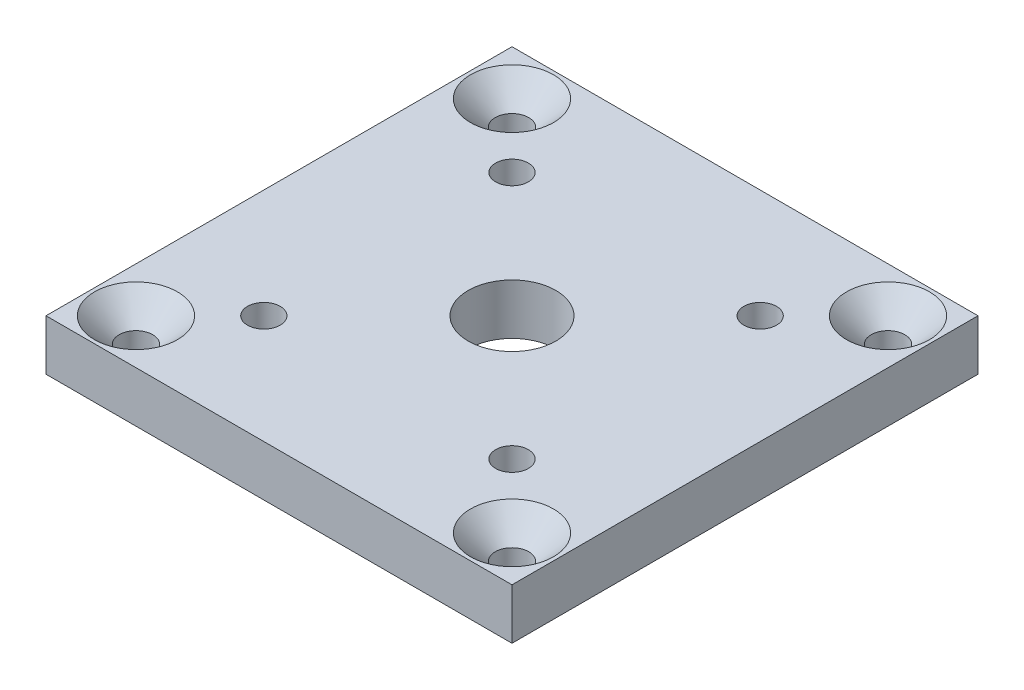
ISO-10303-21;
HEADER;
FILE_DESCRIPTION(('STEP AP214'),'2;1');
FILE_NAME('part.step','',(''),(''),'','','');
FILE_SCHEMA(('AUTOMOTIVE_DESIGN { 1 0 10303 214 1 1 1 1 }'));
ENDSEC;
DATA;
#1=APPLICATION_CONTEXT('core data for automotive mechanical design processes');
#2=APPLICATION_PROTOCOL_DEFINITION('international standard','automotive_design',2000,#1);
#3=PRODUCT_CONTEXT('',#1,'mechanical');
#4=PRODUCT('Part','Part','',(#3));
#5=PRODUCT_RELATED_PRODUCT_CATEGORY('part','',(#4));
#6=PRODUCT_DEFINITION_FORMATION('','',#4);
#7=PRODUCT_DEFINITION_CONTEXT('part definition',#1,'design');
#8=PRODUCT_DEFINITION('design','',#6,#7);
#9=PRODUCT_DEFINITION_SHAPE('','',#8);
#10=(LENGTH_UNIT() NAMED_UNIT(*) SI_UNIT(.MILLI.,.METRE.));
#11=(NAMED_UNIT(*) PLANE_ANGLE_UNIT() SI_UNIT($,.RADIAN.));
#12=(NAMED_UNIT(*) SI_UNIT($,.STERADIAN.) SOLID_ANGLE_UNIT());
#13=UNCERTAINTY_MEASURE_WITH_UNIT(LENGTH_MEASURE(1.E-05),#10,'distance_accuracy_value','');
#14=(GEOMETRIC_REPRESENTATION_CONTEXT(3) GLOBAL_UNCERTAINTY_ASSIGNED_CONTEXT((#13)) GLOBAL_UNIT_ASSIGNED_CONTEXT((#10,
#11,#12)) REPRESENTATION_CONTEXT('',''));
#15=CARTESIAN_POINT('',(0.,0.,0.));
#16=DIRECTION('',(0.,0.,1.));
#17=DIRECTION('',(1.,0.,0.));
#18=AXIS2_PLACEMENT_3D('',#15,#16,#17);
#19=CARTESIAN_POINT('',(0.,6.35,0.));
#20=DIRECTION('',(0.,-1.,0.));
#21=DIRECTION('',(0.,0.,-1.));
#22=AXIS2_PLACEMENT_3D('',#19,#20,#21);
#23=PLANE('',#22);
#24=CARTESIAN_POINT('',(52.78,6.35,-52.78));
#25=DIRECTION('',(0.,-1.,0.));
#26=DIRECTION('',(0.,0.,-1.));
#27=AXIS2_PLACEMENT_3D('',#24,#25,#26);
#28=CIRCLE('',#27,5.20000000000001);
#29=CARTESIAN_POINT('',(52.78,6.35,-57.98));
#30=VERTEX_POINT('',#29);
#31=EDGE_CURVE('E146',#30,#30,#28,.T.);
#32=ORIENTED_EDGE('',*,*,#31,.T.);
#33=EDGE_LOOP('',(#32));
#34=FACE_BOUND('',#33,.T.);
#35=CARTESIAN_POINT('',(52.78,6.35,-5.63999999999999));
#36=DIRECTION('',(0.,-1.,0.));
#37=DIRECTION('',(0.,0.,-1.));
#38=AXIS2_PLACEMENT_3D('',#35,#36,#37);
#39=CIRCLE('',#38,5.20000000000001);
#40=CARTESIAN_POINT('',(52.78,6.35,-10.84));
#41=VERTEX_POINT('',#40);
#42=EDGE_CURVE('E143',#41,#41,#39,.T.);
#43=ORIENTED_EDGE('',*,*,#42,.T.);
#44=EDGE_LOOP('',(#43));
#45=FACE_BOUND('',#44,.T.);
#46=CARTESIAN_POINT('',(5.63999999999999,6.35,-52.78));
#47=DIRECTION('',(0.,-1.,0.));
#48=DIRECTION('',(0.,0.,-1.));
#49=AXIS2_PLACEMENT_3D('',#46,#47,#48);
#50=CIRCLE('',#49,5.20000000000001);
#51=CARTESIAN_POINT('',(5.63999999999999,6.35,-57.98));
#52=VERTEX_POINT('',#51);
#53=EDGE_CURVE('E140',#52,#52,#50,.T.);
#54=ORIENTED_EDGE('',*,*,#53,.T.);
#55=EDGE_LOOP('',(#54));
#56=FACE_BOUND('',#55,.T.);
#57=CARTESIAN_POINT('',(5.63999999999999,6.35,-5.63999999999999));
#58=DIRECTION('',(0.,-1.,0.));
#59=DIRECTION('',(0.,0.,-1.));
#60=AXIS2_PLACEMENT_3D('',#57,#58,#59);
#61=CIRCLE('',#60,5.20000000000001);
#62=CARTESIAN_POINT('',(5.63999999999999,6.35,-0.439999999999983));
#63=VERTEX_POINT('',#62);
#64=EDGE_CURVE('E137',#63,#63,#61,.T.);
#65=ORIENTED_EDGE('',*,*,#64,.T.);
#66=EDGE_LOOP('',(#65));
#67=FACE_BOUND('',#66,.T.);
#68=DIRECTION('',(0.,0.,1.));
#69=VECTOR('',#68,1.);
#70=CARTESIAN_POINT('',(0.,6.35,0.));
#71=LINE('',#70,#69);
#72=CARTESIAN_POINT('',(0.,6.35,-58.42));
#73=VERTEX_POINT('',#72);
#74=CARTESIAN_POINT('',(0.,6.35,0.));
#75=VERTEX_POINT('',#74);
#76=EDGE_CURVE('E85',#73,#75,#71,.T.);
#77=ORIENTED_EDGE('',*,*,#76,.T.);
#78=DIRECTION('',(1.,0.,0.));
#79=VECTOR('',#78,1.);
#80=CARTESIAN_POINT('',(0.,6.35,0.));
#81=LINE('',#80,#79);
#82=CARTESIAN_POINT('',(58.42,6.35,0.));
#83=VERTEX_POINT('',#82);
#84=EDGE_CURVE('E80',#75,#83,#81,.T.);
#85=ORIENTED_EDGE('',*,*,#84,.T.);
#86=DIRECTION('',(0.,0.,-1.));
#87=VECTOR('',#86,1.);
#88=CARTESIAN_POINT('',(58.42,6.35,0.));
#89=LINE('',#88,#87);
#90=CARTESIAN_POINT('',(58.42,6.35,-58.42));
#91=VERTEX_POINT('',#90);
#92=EDGE_CURVE('E83',#83,#91,#89,.T.);
#93=ORIENTED_EDGE('',*,*,#92,.T.);
#94=DIRECTION('',(-1.,0.,0.));
#95=VECTOR('',#94,1.);
#96=CARTESIAN_POINT('',(0.,6.35,-58.42));
#97=LINE('',#96,#95);
#98=EDGE_CURVE('E49',#91,#73,#97,.T.);
#99=ORIENTED_EDGE('',*,*,#98,.T.);
#100=EDGE_LOOP('',(#77,#85,#93,#99));
#101=FACE_BOUND('',#100,.T.);
#102=CARTESIAN_POINT('',(13.6536508138959,6.35,-44.766349186104));
#103=DIRECTION('',(0.,1.,0.));
#104=DIRECTION('',(0.,0.,1.));
#105=AXIS2_PLACEMENT_3D('',#102,#103,#104);
#106=CIRCLE('',#105,2.05);
#107=CARTESIAN_POINT('',(13.6536508138959,6.35,-42.716349186104));
#108=VERTEX_POINT('',#107);
#109=EDGE_CURVE('E237',#108,#108,#106,.T.);
#110=ORIENTED_EDGE('',*,*,#109,.F.);
#111=EDGE_LOOP('',(#110));
#112=FACE_BOUND('',#111,.T.);
#113=CARTESIAN_POINT('',(44.766349186104,6.35,-44.766349186104));
#114=DIRECTION('',(0.,1.,0.));
#115=DIRECTION('',(0.,0.,1.));
#116=AXIS2_PLACEMENT_3D('',#113,#114,#115);
#117=CIRCLE('',#116,2.05);
#118=CARTESIAN_POINT('',(44.766349186104,6.35,-42.716349186104));
#119=VERTEX_POINT('',#118);
#120=EDGE_CURVE('E240',#119,#119,#117,.T.);
#121=ORIENTED_EDGE('',*,*,#120,.F.);
#122=EDGE_LOOP('',(#121));
#123=FACE_BOUND('',#122,.T.);
#124=CARTESIAN_POINT('',(44.766349186104,6.35,-13.6536508138959));
#125=DIRECTION('',(0.,1.,0.));
#126=DIRECTION('',(0.,0.,1.));
#127=AXIS2_PLACEMENT_3D('',#124,#125,#126);
#128=CIRCLE('',#127,2.04999999999999);
#129=CARTESIAN_POINT('',(44.766349186104,6.35,-11.603650813896));
#130=VERTEX_POINT('',#129);
#131=EDGE_CURVE('E243',#130,#130,#128,.T.);
#132=ORIENTED_EDGE('',*,*,#131,.F.);
#133=EDGE_LOOP('',(#132));
#134=FACE_BOUND('',#133,.T.);
#135=CARTESIAN_POINT('',(13.6536508138959,6.35,-13.6536508138959));
#136=DIRECTION('',(0.,1.,0.));
#137=DIRECTION('',(0.,0.,1.));
#138=AXIS2_PLACEMENT_3D('',#135,#136,#137);
#139=CIRCLE('',#138,2.05);
#140=CARTESIAN_POINT('',(13.6536508138959,6.35,-11.6036508138959));
#141=VERTEX_POINT('',#140);
#142=EDGE_CURVE('E246',#141,#141,#139,.T.);
#143=ORIENTED_EDGE('',*,*,#142,.F.);
#144=EDGE_LOOP('',(#143));
#145=FACE_BOUND('',#144,.T.);
#146=CARTESIAN_POINT('',(29.21,6.35,-29.21));
#147=DIRECTION('',(0.,1.,0.));
#148=DIRECTION('',(0.,0.,1.));
#149=AXIS2_PLACEMENT_3D('',#146,#147,#148);
#150=CIRCLE('',#149,5.5);
#151=CARTESIAN_POINT('',(29.21,6.35,-23.71));
#152=VERTEX_POINT('',#151);
#153=EDGE_CURVE('E249',#152,#152,#150,.T.);
#154=ORIENTED_EDGE('',*,*,#153,.F.);
#155=EDGE_LOOP('',(#154));
#156=FACE_BOUND('',#155,.T.);
#157=ADVANCED_FACE('F32',(#34,#45,#56,#67,#101,#112,#123,#134,#145,#156),#23,.F.);
#158=CARTESIAN_POINT('',(0.,0.,0.));
#159=DIRECTION('',(0.,-1.,0.));
#160=DIRECTION('',(0.,0.,-1.));
#161=AXIS2_PLACEMENT_3D('',#158,#159,#160);
#162=PLANE('',#161);
#163=CARTESIAN_POINT('',(13.6536508138959,0.,-44.766349186104));
#164=DIRECTION('',(0.,-1.,0.));
#165=DIRECTION('',(0.,0.,-1.));
#166=AXIS2_PLACEMENT_3D('',#163,#164,#165);
#167=CIRCLE('',#166,4.53000000000001);
#168=CARTESIAN_POINT('',(13.6536508138959,0.,-49.296349186104));
#169=VERTEX_POINT('',#168);
#170=EDGE_CURVE('E119',#169,#169,#167,.F.);
#171=ORIENTED_EDGE('',*,*,#170,.T.);
#172=EDGE_LOOP('',(#171));
#173=FACE_BOUND('',#172,.T.);
#174=CARTESIAN_POINT('',(44.766349186104,0.,-44.766349186104));
#175=DIRECTION('',(0.,-1.,0.));
#176=DIRECTION('',(0.,0.,-1.));
#177=AXIS2_PLACEMENT_3D('',#174,#175,#176);
#178=CIRCLE('',#177,4.53000000000001);
#179=CARTESIAN_POINT('',(44.766349186104,0.,-49.296349186104));
#180=VERTEX_POINT('',#179);
#181=EDGE_CURVE('E116',#180,#180,#178,.F.);
#182=ORIENTED_EDGE('',*,*,#181,.T.);
#183=EDGE_LOOP('',(#182));
#184=FACE_BOUND('',#183,.T.);
#185=CARTESIAN_POINT('',(44.766349186104,0.,-13.6536508138959));
#186=DIRECTION('',(0.,-1.,0.));
#187=DIRECTION('',(0.,0.,-1.));
#188=AXIS2_PLACEMENT_3D('',#185,#186,#187);
#189=CIRCLE('',#188,4.52999999999999);
#190=CARTESIAN_POINT('',(44.766349186104,0.,-18.1836508138959));
#191=VERTEX_POINT('',#190);
#192=EDGE_CURVE('E113',#191,#191,#189,.F.);
#193=ORIENTED_EDGE('',*,*,#192,.T.);
#194=EDGE_LOOP('',(#193));
#195=FACE_BOUND('',#194,.T.);
#196=CARTESIAN_POINT('',(13.6536508138959,0.,-13.6536508138959));
#197=DIRECTION('',(0.,-1.,0.));
#198=DIRECTION('',(0.,0.,-1.));
#199=AXIS2_PLACEMENT_3D('',#196,#197,#198);
#200=CIRCLE('',#199,4.53000000000001);
#201=CARTESIAN_POINT('',(13.6536508138959,0.,-18.183650813896));
#202=VERTEX_POINT('',#201);
#203=EDGE_CURVE('E110',#202,#202,#200,.F.);
#204=ORIENTED_EDGE('',*,*,#203,.T.);
#205=EDGE_LOOP('',(#204));
#206=FACE_BOUND('',#205,.T.);
#207=CARTESIAN_POINT('',(5.63999999999999,0.,-5.63999999999999));
#208=DIRECTION('',(0.,1.,0.));
#209=DIRECTION('',(0.,0.,1.));
#210=AXIS2_PLACEMENT_3D('',#207,#208,#209);
#211=CIRCLE('',#210,2.1);
#212=CARTESIAN_POINT('',(5.63999999999999,0.,-3.53999999999999));
#213=VERTEX_POINT('',#212);
#214=EDGE_CURVE('E232',#213,#213,#211,.T.);
#215=ORIENTED_EDGE('',*,*,#214,.T.);
#216=EDGE_LOOP('',(#215));
#217=FACE_BOUND('',#216,.T.);
#218=CARTESIAN_POINT('',(52.78,0.,-52.78));
#219=DIRECTION('',(0.,1.,0.));
#220=DIRECTION('',(0.,0.,1.));
#221=AXIS2_PLACEMENT_3D('',#218,#219,#220);
#222=CIRCLE('',#221,2.1);
#223=CARTESIAN_POINT('',(52.78,0.,-50.68));
#224=VERTEX_POINT('',#223);
#225=EDGE_CURVE('E225',#224,#224,#222,.T.);
#226=ORIENTED_EDGE('',*,*,#225,.T.);
#227=EDGE_LOOP('',(#226));
#228=FACE_BOUND('',#227,.T.);
#229=DIRECTION('',(0.,0.,1.));
#230=VECTOR('',#229,1.);
#231=CARTESIAN_POINT('',(0.,0.,0.));
#232=LINE('',#231,#230);
#233=CARTESIAN_POINT('',(0.,0.,-58.42));
#234=VERTEX_POINT('',#233);
#235=CARTESIAN_POINT('',(0.,0.,0.));
#236=VERTEX_POINT('',#235);
#237=EDGE_CURVE('E100',#234,#236,#232,.T.);
#238=ORIENTED_EDGE('',*,*,#237,.F.);
#239=DIRECTION('',(-1.,0.,0.));
#240=VECTOR('',#239,1.);
#241=CARTESIAN_POINT('',(0.,0.,-58.42));
#242=LINE('',#241,#240);
#243=CARTESIAN_POINT('',(58.42,0.,-58.42));
#244=VERTEX_POINT('',#243);
#245=EDGE_CURVE('E72',#244,#234,#242,.T.);
#246=ORIENTED_EDGE('',*,*,#245,.F.);
#247=DIRECTION('',(0.,0.,-1.));
#248=VECTOR('',#247,1.);
#249=CARTESIAN_POINT('',(58.42,0.,0.));
#250=LINE('',#249,#248);
#251=CARTESIAN_POINT('',(58.42,0.,0.));
#252=VERTEX_POINT('',#251);
#253=EDGE_CURVE('E66',#252,#244,#250,.T.);
#254=ORIENTED_EDGE('',*,*,#253,.F.);
#255=DIRECTION('',(1.,0.,0.));
#256=VECTOR('',#255,1.);
#257=CARTESIAN_POINT('',(0.,0.,0.));
#258=LINE('',#257,#256);
#259=EDGE_CURVE('E90',#236,#252,#258,.T.);
#260=ORIENTED_EDGE('',*,*,#259,.F.);
#261=EDGE_LOOP('',(#238,#246,#254,#260));
#262=FACE_BOUND('',#261,.T.);
#263=CARTESIAN_POINT('',(5.63999999999999,0.,-52.78));
#264=DIRECTION('',(0.,1.,0.));
#265=DIRECTION('',(0.,0.,1.));
#266=AXIS2_PLACEMENT_3D('',#263,#264,#265);
#267=CIRCLE('',#266,2.1);
#268=CARTESIAN_POINT('',(5.63999999999999,0.,-50.68));
#269=VERTEX_POINT('',#268);
#270=EDGE_CURVE('E103',#269,#269,#267,.T.);
#271=ORIENTED_EDGE('',*,*,#270,.T.);
#272=EDGE_LOOP('',(#271));
#273=FACE_BOUND('',#272,.T.);
#274=CARTESIAN_POINT('',(52.78,0.,-5.63999999999999));
#275=DIRECTION('',(0.,1.,0.));
#276=DIRECTION('',(0.,0.,1.));
#277=AXIS2_PLACEMENT_3D('',#274,#275,#276);
#278=CIRCLE('',#277,2.1);
#279=CARTESIAN_POINT('',(52.78,0.,-3.54));
#280=VERTEX_POINT('',#279);
#281=EDGE_CURVE('E227',#280,#280,#278,.T.);
#282=ORIENTED_EDGE('',*,*,#281,.T.);
#283=EDGE_LOOP('',(#282));
#284=FACE_BOUND('',#283,.T.);
#285=CARTESIAN_POINT('',(29.21,0.,-29.21));
#286=DIRECTION('',(0.,1.,0.));
#287=DIRECTION('',(0.,0.,1.));
#288=AXIS2_PLACEMENT_3D('',#285,#286,#287);
#289=CIRCLE('',#288,5.5);
#290=CARTESIAN_POINT('',(29.21,0.,-23.71));
#291=VERTEX_POINT('',#290);
#292=EDGE_CURVE('E250',#291,#291,#289,.T.);
#293=ORIENTED_EDGE('',*,*,#292,.T.);
#294=EDGE_LOOP('',(#293));
#295=FACE_BOUND('',#294,.T.);
#296=ADVANCED_FACE('F171',(#173,#184,#195,#206,#217,#228,#262,#273,#284,#295),#162,.T.);
#297=CARTESIAN_POINT('',(0.,6.35,0.));
#298=DIRECTION('',(1.,0.,0.));
#299=DIRECTION('',(0.,0.,-1.));
#300=AXIS2_PLACEMENT_3D('',#297,#298,#299);
#301=PLANE('',#300);
#302=ORIENTED_EDGE('',*,*,#237,.T.);
#303=DIRECTION('',(0.,-1.,0.));
#304=VECTOR('',#303,1.);
#305=CARTESIAN_POINT('',(0.,6.35,0.));
#306=LINE('',#305,#304);
#307=EDGE_CURVE('E91',#75,#236,#306,.T.);
#308=ORIENTED_EDGE('',*,*,#307,.F.);
#309=ORIENTED_EDGE('',*,*,#76,.F.);
#310=DIRECTION('',(0.,-1.,0.));
#311=VECTOR('',#310,1.);
#312=CARTESIAN_POINT('',(0.,6.35,-58.42));
#313=LINE('',#312,#311);
#314=EDGE_CURVE('E96',#73,#234,#313,.T.);
#315=ORIENTED_EDGE('',*,*,#314,.T.);
#316=EDGE_LOOP('',(#302,#308,#309,#315));
#317=FACE_BOUND('',#316,.T.);
#318=ADVANCED_FACE('F177',(#317),#301,.F.);
#319=CARTESIAN_POINT('',(0.,6.35,0.));
#320=DIRECTION('',(0.,0.,-1.));
#321=DIRECTION('',(-1.,0.,0.));
#322=AXIS2_PLACEMENT_3D('',#319,#320,#321);
#323=PLANE('',#322);
#324=ORIENTED_EDGE('',*,*,#259,.T.);
#325=DIRECTION('',(0.,-1.,0.));
#326=VECTOR('',#325,1.);
#327=CARTESIAN_POINT('',(58.42,6.35,0.));
#328=LINE('',#327,#326);
#329=EDGE_CURVE('E88',#83,#252,#328,.T.);
#330=ORIENTED_EDGE('',*,*,#329,.F.);
#331=ORIENTED_EDGE('',*,*,#84,.F.);
#332=ORIENTED_EDGE('',*,*,#307,.T.);
#333=EDGE_LOOP('',(#324,#330,#331,#332));
#334=FACE_BOUND('',#333,.T.);
#335=ADVANCED_FACE('F89',(#334),#323,.F.);
#336=CARTESIAN_POINT('',(58.42,6.35,0.));
#337=DIRECTION('',(-1.,0.,0.));
#338=DIRECTION('',(0.,0.,1.));
#339=AXIS2_PLACEMENT_3D('',#336,#337,#338);
#340=PLANE('',#339);
#341=ORIENTED_EDGE('',*,*,#253,.T.);
#342=DIRECTION('',(0.,-1.,0.));
#343=VECTOR('',#342,1.);
#344=CARTESIAN_POINT('',(58.42,6.35,-58.42));
#345=LINE('',#344,#343);
#346=EDGE_CURVE('E92',#91,#244,#345,.T.);
#347=ORIENTED_EDGE('',*,*,#346,.F.);
#348=ORIENTED_EDGE('',*,*,#92,.F.);
#349=ORIENTED_EDGE('',*,*,#329,.T.);
#350=EDGE_LOOP('',(#341,#347,#348,#349));
#351=FACE_BOUND('',#350,.T.);
#352=ADVANCED_FACE('F94',(#351),#340,.F.);
#353=CARTESIAN_POINT('',(0.,6.35,-58.42));
#354=DIRECTION('',(0.,0.,1.));
#355=DIRECTION('',(1.,0.,0.));
#356=AXIS2_PLACEMENT_3D('',#353,#354,#355);
#357=PLANE('',#356);
#358=ORIENTED_EDGE('',*,*,#245,.T.);
#359=ORIENTED_EDGE('',*,*,#314,.F.);
#360=ORIENTED_EDGE('',*,*,#98,.F.);
#361=ORIENTED_EDGE('',*,*,#346,.T.);
#362=EDGE_LOOP('',(#358,#359,#360,#361));
#363=FACE_BOUND('',#362,.T.);
#364=ADVANCED_FACE('F184',(#363),#357,.F.);
#365=CARTESIAN_POINT('',(5.63999999999999,6.35,-52.78));
#366=DIRECTION('',(0.,-1.,0.));
#367=DIRECTION('',(0.,0.,-1.));
#368=AXIS2_PLACEMENT_3D('',#365,#366,#367);
#369=CYLINDRICAL_SURFACE('',#368,2.1);
#370=CARTESIAN_POINT('',(5.63999999999999,3.25000000000001,-52.78));
#371=DIRECTION('',(0.,-1.,0.));
#372=DIRECTION('',(0.,0.,-1.));
#373=AXIS2_PLACEMENT_3D('',#370,#371,#372);
#374=CIRCLE('',#373,2.1);
#375=CARTESIAN_POINT('',(5.63999999999999,3.25000000000001,-54.88));
#376=VERTEX_POINT('',#375);
#377=EDGE_CURVE('E41',#376,#376,#374,.F.);
#378=ORIENTED_EDGE('',*,*,#377,.T.);
#379=EDGE_LOOP('',(#378));
#380=FACE_BOUND('',#379,.T.);
#381=ORIENTED_EDGE('',*,*,#270,.F.);
#382=EDGE_LOOP('',(#381));
#383=FACE_BOUND('',#382,.T.);
#384=ADVANCED_FACE('F154',(#380,#383),#369,.F.);
#385=CARTESIAN_POINT('',(52.78,6.35,-52.78));
#386=DIRECTION('',(0.,-1.,0.));
#387=DIRECTION('',(0.,0.,-1.));
#388=AXIS2_PLACEMENT_3D('',#385,#386,#387);
#389=CYLINDRICAL_SURFACE('',#388,2.1);
#390=CARTESIAN_POINT('',(52.78,3.25000000000001,-52.78));
#391=DIRECTION('',(0.,-1.,0.));
#392=DIRECTION('',(0.,0.,-1.));
#393=AXIS2_PLACEMENT_3D('',#390,#391,#392);
#394=CIRCLE('',#393,2.1);
#395=CARTESIAN_POINT('',(52.78,3.25000000000001,-54.88));
#396=VERTEX_POINT('',#395);
#397=EDGE_CURVE('E134',#396,#396,#394,.F.);
#398=ORIENTED_EDGE('',*,*,#397,.T.);
#399=EDGE_LOOP('',(#398));
#400=FACE_BOUND('',#399,.T.);
#401=ORIENTED_EDGE('',*,*,#225,.F.);
#402=EDGE_LOOP('',(#401));
#403=FACE_BOUND('',#402,.T.);
#404=ADVANCED_FACE('F219',(#400,#403),#389,.F.);
#405=CARTESIAN_POINT('',(52.78,6.35,-5.63999999999999));
#406=DIRECTION('',(0.,-1.,0.));
#407=DIRECTION('',(0.,0.,-1.));
#408=AXIS2_PLACEMENT_3D('',#405,#406,#407);
#409=CYLINDRICAL_SURFACE('',#408,2.1);
#410=CARTESIAN_POINT('',(52.78,3.25000000000001,-5.63999999999999));
#411=DIRECTION('',(0.,-1.,0.));
#412=DIRECTION('',(0.,0.,-1.));
#413=AXIS2_PLACEMENT_3D('',#410,#411,#412);
#414=CIRCLE('',#413,2.1);
#415=CARTESIAN_POINT('',(52.78,3.25000000000001,-7.73999999999999));
#416=VERTEX_POINT('',#415);
#417=EDGE_CURVE('E149',#416,#416,#414,.F.);
#418=ORIENTED_EDGE('',*,*,#417,.T.);
#419=EDGE_LOOP('',(#418));
#420=FACE_BOUND('',#419,.T.);
#421=ORIENTED_EDGE('',*,*,#281,.F.);
#422=EDGE_LOOP('',(#421));
#423=FACE_BOUND('',#422,.T.);
#424=ADVANCED_FACE('F222',(#420,#423),#409,.F.);
#425=CARTESIAN_POINT('',(5.63999999999999,6.35,-5.63999999999999));
#426=DIRECTION('',(0.,-1.,0.));
#427=DIRECTION('',(0.,0.,-1.));
#428=AXIS2_PLACEMENT_3D('',#425,#426,#427);
#429=CYLINDRICAL_SURFACE('',#428,2.1);
#430=CARTESIAN_POINT('',(5.63999999999999,3.25000000000001,-5.63999999999999));
#431=DIRECTION('',(0.,-1.,0.));
#432=DIRECTION('',(0.,0.,-1.));
#433=AXIS2_PLACEMENT_3D('',#430,#431,#432);
#434=CIRCLE('',#433,2.1);
#435=CARTESIAN_POINT('',(5.63999999999999,3.25000000000001,-3.53999999999999));
#436=VERTEX_POINT('',#435);
#437=EDGE_CURVE('E11',#436,#436,#434,.F.);
#438=ORIENTED_EDGE('',*,*,#437,.T.);
#439=EDGE_LOOP('',(#438));
#440=FACE_BOUND('',#439,.T.);
#441=ORIENTED_EDGE('',*,*,#214,.F.);
#442=EDGE_LOOP('',(#441));
#443=FACE_BOUND('',#442,.T.);
#444=ADVANCED_FACE('F280',(#440,#443),#429,.F.);
#445=CARTESIAN_POINT('',(13.6536508138959,6.35,-44.766349186104));
#446=DIRECTION('',(0.,-1.,0.));
#447=DIRECTION('',(0.,0.,-1.));
#448=AXIS2_PLACEMENT_3D('',#445,#446,#447);
#449=CYLINDRICAL_SURFACE('',#448,2.05);
#450=CARTESIAN_POINT('',(13.6536508138959,2.48000000000001,-44.766349186104));
#451=DIRECTION('',(0.,-1.,0.));
#452=DIRECTION('',(0.,0.,-1.));
#453=AXIS2_PLACEMENT_3D('',#450,#451,#452);
#454=CIRCLE('',#453,2.05);
#455=CARTESIAN_POINT('',(13.6536508138959,2.48000000000001,-46.816349186104));
#456=VERTEX_POINT('',#455);
#457=EDGE_CURVE('E122',#456,#456,#454,.T.);
#458=ORIENTED_EDGE('',*,*,#457,.T.);
#459=EDGE_LOOP('',(#458));
#460=FACE_BOUND('',#459,.T.);
#461=ORIENTED_EDGE('',*,*,#109,.T.);
#462=EDGE_LOOP('',(#461));
#463=FACE_BOUND('',#462,.T.);
#464=ADVANCED_FACE('F276',(#460,#463),#449,.F.);
#465=CARTESIAN_POINT('',(44.766349186104,6.35,-44.766349186104));
#466=DIRECTION('',(0.,-1.,0.));
#467=DIRECTION('',(0.,0.,-1.));
#468=AXIS2_PLACEMENT_3D('',#465,#466,#467);
#469=CYLINDRICAL_SURFACE('',#468,2.05);
#470=CARTESIAN_POINT('',(44.766349186104,2.48000000000001,-44.766349186104));
#471=DIRECTION('',(0.,-1.,0.));
#472=DIRECTION('',(0.,0.,-1.));
#473=AXIS2_PLACEMENT_3D('',#470,#471,#472);
#474=CIRCLE('',#473,2.05);
#475=CARTESIAN_POINT('',(44.766349186104,2.48000000000001,-46.816349186104));
#476=VERTEX_POINT('',#475);
#477=EDGE_CURVE('E125',#476,#476,#474,.T.);
#478=ORIENTED_EDGE('',*,*,#477,.T.);
#479=EDGE_LOOP('',(#478));
#480=FACE_BOUND('',#479,.T.);
#481=ORIENTED_EDGE('',*,*,#120,.T.);
#482=EDGE_LOOP('',(#481));
#483=FACE_BOUND('',#482,.T.);
#484=ADVANCED_FACE('F272',(#480,#483),#469,.F.);
#485=CARTESIAN_POINT('',(44.766349186104,6.35,-13.6536508138959));
#486=DIRECTION('',(0.,-1.,0.));
#487=DIRECTION('',(0.,0.,-1.));
#488=AXIS2_PLACEMENT_3D('',#485,#486,#487);
#489=CYLINDRICAL_SURFACE('',#488,2.04999999999999);
#490=CARTESIAN_POINT('',(44.766349186104,2.47999999999999,-13.6536508138959));
#491=DIRECTION('',(0.,-1.,0.));
#492=DIRECTION('',(0.,0.,-1.));
#493=AXIS2_PLACEMENT_3D('',#490,#491,#492);
#494=CIRCLE('',#493,2.04999999999999);
#495=CARTESIAN_POINT('',(44.766349186104,2.47999999999999,-15.7036508138959));
#496=VERTEX_POINT('',#495);
#497=EDGE_CURVE('E128',#496,#496,#494,.T.);
#498=ORIENTED_EDGE('',*,*,#497,.T.);
#499=EDGE_LOOP('',(#498));
#500=FACE_BOUND('',#499,.T.);
#501=ORIENTED_EDGE('',*,*,#131,.T.);
#502=EDGE_LOOP('',(#501));
#503=FACE_BOUND('',#502,.T.);
#504=ADVANCED_FACE('F266',(#500,#503),#489,.F.);
#505=CARTESIAN_POINT('',(13.6536508138959,6.35,-13.6536508138959));
#506=DIRECTION('',(0.,-1.,0.));
#507=DIRECTION('',(0.,0.,-1.));
#508=AXIS2_PLACEMENT_3D('',#505,#506,#507);
#509=CYLINDRICAL_SURFACE('',#508,2.05);
#510=CARTESIAN_POINT('',(13.6536508138959,2.48000000000001,-13.6536508138959));
#511=DIRECTION('',(0.,-1.,0.));
#512=DIRECTION('',(0.,0.,-1.));
#513=AXIS2_PLACEMENT_3D('',#510,#511,#512);
#514=CIRCLE('',#513,2.05);
#515=CARTESIAN_POINT('',(13.6536508138959,2.48000000000001,-15.7036508138959));
#516=VERTEX_POINT('',#515);
#517=EDGE_CURVE('E131',#516,#516,#514,.T.);
#518=ORIENTED_EDGE('',*,*,#517,.T.);
#519=EDGE_LOOP('',(#518));
#520=FACE_BOUND('',#519,.T.);
#521=ORIENTED_EDGE('',*,*,#142,.T.);
#522=EDGE_LOOP('',(#521));
#523=FACE_BOUND('',#522,.T.);
#524=ADVANCED_FACE('F259',(#520,#523),#509,.F.);
#525=CARTESIAN_POINT('',(29.21,6.35,-29.21));
#526=DIRECTION('',(0.,-1.,0.));
#527=DIRECTION('',(0.,0.,-1.));
#528=AXIS2_PLACEMENT_3D('',#525,#526,#527);
#529=CYLINDRICAL_SURFACE('',#528,5.5);
#530=ORIENTED_EDGE('',*,*,#153,.T.);
#531=EDGE_LOOP('',(#530));
#532=FACE_BOUND('',#531,.T.);
#533=ORIENTED_EDGE('',*,*,#292,.F.);
#534=EDGE_LOOP('',(#533));
#535=FACE_BOUND('',#534,.T.);
#536=ADVANCED_FACE('F198',(#532,#535),#529,.F.);
#537=CARTESIAN_POINT('',(13.6536508138959,0.,-44.766349186104));
#538=DIRECTION('',(0.,-1.,0.));
#539=DIRECTION('',(0.,0.,-1.));
#540=AXIS2_PLACEMENT_3D('',#537,#538,#539);
#541=CONICAL_SURFACE('',#540,4.53000000000001,0.785398163397448);
#542=ORIENTED_EDGE('',*,*,#457,.F.);
#543=EDGE_LOOP('',(#542));
#544=FACE_BOUND('',#543,.T.);
#545=ORIENTED_EDGE('',*,*,#170,.F.);
#546=EDGE_LOOP('',(#545));
#547=FACE_BOUND('',#546,.T.);
#548=ADVANCED_FACE('F194',(#544,#547),#541,.F.);
#549=CARTESIAN_POINT('',(44.766349186104,0.,-44.766349186104));
#550=DIRECTION('',(0.,-1.,0.));
#551=DIRECTION('',(0.,0.,-1.));
#552=AXIS2_PLACEMENT_3D('',#549,#550,#551);
#553=CONICAL_SURFACE('',#552,4.53000000000001,0.785398163397448);
#554=ORIENTED_EDGE('',*,*,#477,.F.);
#555=EDGE_LOOP('',(#554));
#556=FACE_BOUND('',#555,.T.);
#557=ORIENTED_EDGE('',*,*,#181,.F.);
#558=EDGE_LOOP('',(#557));
#559=FACE_BOUND('',#558,.T.);
#560=ADVANCED_FACE('F197',(#556,#559),#553,.F.);
#561=CARTESIAN_POINT('',(44.766349186104,0.,-13.6536508138959));
#562=DIRECTION('',(0.,-1.,0.));
#563=DIRECTION('',(0.,0.,-1.));
#564=AXIS2_PLACEMENT_3D('',#561,#562,#563);
#565=CONICAL_SURFACE('',#564,4.52999999999999,0.785398163397448);
#566=ORIENTED_EDGE('',*,*,#497,.F.);
#567=EDGE_LOOP('',(#566));
#568=FACE_BOUND('',#567,.T.);
#569=ORIENTED_EDGE('',*,*,#192,.F.);
#570=EDGE_LOOP('',(#569));
#571=FACE_BOUND('',#570,.T.);
#572=ADVANCED_FACE('F202',(#568,#571),#565,.F.);
#573=CARTESIAN_POINT('',(13.6536508138959,0.,-13.6536508138959));
#574=DIRECTION('',(0.,-1.,0.));
#575=DIRECTION('',(0.,0.,-1.));
#576=AXIS2_PLACEMENT_3D('',#573,#574,#575);
#577=CONICAL_SURFACE('',#576,4.53000000000001,0.785398163397448);
#578=ORIENTED_EDGE('',*,*,#517,.F.);
#579=EDGE_LOOP('',(#578));
#580=FACE_BOUND('',#579,.T.);
#581=ORIENTED_EDGE('',*,*,#203,.F.);
#582=EDGE_LOOP('',(#581));
#583=FACE_BOUND('',#582,.T.);
#584=ADVANCED_FACE('F206',(#580,#583),#577,.F.);
#585=CARTESIAN_POINT('',(52.78,3.25000000000001,-52.78));
#586=DIRECTION('',(0.,1.,0.));
#587=DIRECTION('',(0.,0.,1.));
#588=AXIS2_PLACEMENT_3D('',#585,#586,#587);
#589=CONICAL_SURFACE('',#588,2.1,0.785398163397452);
#590=ORIENTED_EDGE('',*,*,#31,.F.);
#591=EDGE_LOOP('',(#590));
#592=FACE_BOUND('',#591,.T.);
#593=ORIENTED_EDGE('',*,*,#397,.F.);
#594=EDGE_LOOP('',(#593));
#595=FACE_BOUND('',#594,.T.);
#596=ADVANCED_FACE('F166',(#592,#595),#589,.F.);
#597=CARTESIAN_POINT('',(52.78,3.25000000000001,-5.63999999999999));
#598=DIRECTION('',(0.,1.,0.));
#599=DIRECTION('',(0.,0.,1.));
#600=AXIS2_PLACEMENT_3D('',#597,#598,#599);
#601=CONICAL_SURFACE('',#600,2.1,0.785398163397452);
#602=ORIENTED_EDGE('',*,*,#42,.F.);
#603=EDGE_LOOP('',(#602));
#604=FACE_BOUND('',#603,.T.);
#605=ORIENTED_EDGE('',*,*,#417,.F.);
#606=EDGE_LOOP('',(#605));
#607=FACE_BOUND('',#606,.T.);
#608=ADVANCED_FACE('F159',(#604,#607),#601,.F.);
#609=CARTESIAN_POINT('',(5.63999999999999,3.25000000000001,-52.78));
#610=DIRECTION('',(0.,1.,0.));
#611=DIRECTION('',(0.,0.,1.));
#612=AXIS2_PLACEMENT_3D('',#609,#610,#611);
#613=CONICAL_SURFACE('',#612,2.1,0.785398163397452);
#614=ORIENTED_EDGE('',*,*,#53,.F.);
#615=EDGE_LOOP('',(#614));
#616=FACE_BOUND('',#615,.T.);
#617=ORIENTED_EDGE('',*,*,#377,.F.);
#618=EDGE_LOOP('',(#617));
#619=FACE_BOUND('',#618,.T.);
#620=ADVANCED_FACE('F157',(#616,#619),#613,.F.);
#621=CARTESIAN_POINT('',(5.63999999999999,3.25000000000001,-5.63999999999999));
#622=DIRECTION('',(0.,1.,0.));
#623=DIRECTION('',(0.,0.,1.));
#624=AXIS2_PLACEMENT_3D('',#621,#622,#623);
#625=CONICAL_SURFACE('',#624,2.1,0.785398163397452);
#626=CARTESIAN_POINT('',(5.63999999999999,6.35,-0.439999999999983));
#627=CARTESIAN_POINT('',(5.63999999999999,6.31770833333333,-0.47229166666665));
#628=CARTESIAN_POINT('',(5.63999999999999,6.28541666666667,-0.504583333333317));
#629=CARTESIAN_POINT('',(5.63999999999999,6.22083333333333,-0.56916666666665));
#630=CARTESIAN_POINT('',(5.63999999999999,6.18854166666667,-0.601458333333317));
#631=CARTESIAN_POINT('',(5.63999999999999,6.12395833333333,-0.66604166666665));
#632=CARTESIAN_POINT('',(5.63999999999999,6.09166666666667,-0.698333333333317));
#633=CARTESIAN_POINT('',(5.63999999999999,6.02708333333333,-0.762916666666651));
#634=CARTESIAN_POINT('',(5.63999999999999,5.99479166666667,-0.795208333333318));
#635=CARTESIAN_POINT('',(5.63999999999999,5.93020833333333,-0.859791666666651));
#636=CARTESIAN_POINT('',(5.63999999999999,5.89791666666667,-0.892083333333318));
#637=CARTESIAN_POINT('',(5.63999999999999,5.83333333333334,-0.956666666666651));
#638=CARTESIAN_POINT('',(5.63999999999999,5.80104166666667,-0.988958333333318));
#639=CARTESIAN_POINT('',(5.63999999999999,5.73645833333334,-1.05354166666665));
#640=CARTESIAN_POINT('',(5.63999999999999,5.70416666666667,-1.08583333333332));
#641=CARTESIAN_POINT('',(5.63999999999999,5.63958333333334,-1.15041666666665));
#642=CARTESIAN_POINT('',(5.63999999999999,5.60729166666667,-1.18270833333332));
#643=CARTESIAN_POINT('',(5.63999999999999,5.54270833333334,-1.24729166666665));
#644=CARTESIAN_POINT('',(5.63999999999999,5.51041666666667,-1.27958333333332));
#645=CARTESIAN_POINT('',(5.63999999999999,5.44583333333334,-1.34416666666665));
#646=CARTESIAN_POINT('',(5.63999999999999,5.41354166666667,-1.37645833333332));
#647=CARTESIAN_POINT('',(5.63999999999999,5.34895833333334,-1.44104166666665));
#648=CARTESIAN_POINT('',(5.63999999999999,5.31666666666667,-1.47333333333332));
#649=CARTESIAN_POINT('',(5.63999999999999,5.25208333333334,-1.53791666666665));
#650=CARTESIAN_POINT('',(5.63999999999999,5.21979166666667,-1.57020833333332));
#651=CARTESIAN_POINT('',(5.63999999999999,5.15520833333334,-1.63479166666665));
#652=CARTESIAN_POINT('',(5.63999999999999,5.12291666666667,-1.66708333333332));
#653=CARTESIAN_POINT('',(5.63999999999999,5.05833333333334,-1.73166666666665));
#654=CARTESIAN_POINT('',(5.63999999999999,5.02604166666667,-1.76395833333332));
#655=CARTESIAN_POINT('',(5.63999999999999,4.96145833333334,-1.82854166666665));
#656=CARTESIAN_POINT('',(5.63999999999999,4.92916666666667,-1.86083333333332));
#657=CARTESIAN_POINT('',(5.63999999999999,4.86458333333334,-1.92541666666665));
#658=CARTESIAN_POINT('',(5.63999999999999,4.83229166666667,-1.95770833333332));
#659=CARTESIAN_POINT('',(5.63999999999999,4.76770833333334,-2.02229166666666));
#660=CARTESIAN_POINT('',(5.63999999999999,4.73541666666667,-2.05458333333332));
#661=CARTESIAN_POINT('',(5.63999999999999,4.67083333333334,-2.11916666666666));
#662=CARTESIAN_POINT('',(5.63999999999999,4.63854166666667,-2.15145833333332));
#663=CARTESIAN_POINT('',(5.63999999999999,4.57395833333334,-2.21604166666666));
#664=CARTESIAN_POINT('',(5.63999999999999,4.54166666666667,-2.24833333333332));
#665=CARTESIAN_POINT('',(5.63999999999999,4.47708333333334,-2.31291666666666));
#666=CARTESIAN_POINT('',(5.63999999999999,4.44479166666667,-2.34520833333332));
#667=CARTESIAN_POINT('',(5.63999999999999,4.38020833333334,-2.40979166666666));
#668=CARTESIAN_POINT('',(5.63999999999999,4.34791666666667,-2.44208333333332));
#669=CARTESIAN_POINT('',(5.63999999999999,4.28333333333334,-2.50666666666666));
#670=CARTESIAN_POINT('',(5.63999999999999,4.25104166666667,-2.53895833333332));
#671=CARTESIAN_POINT('',(5.63999999999999,4.18645833333334,-2.60354166666666));
#672=CARTESIAN_POINT('',(5.63999999999999,4.15416666666667,-2.63583333333332));
#673=CARTESIAN_POINT('',(5.63999999999999,4.08958333333334,-2.70041666666666));
#674=CARTESIAN_POINT('',(5.63999999999999,4.05729166666667,-2.73270833333332));
#675=CARTESIAN_POINT('',(5.63999999999999,3.99270833333334,-2.79729166666666));
#676=CARTESIAN_POINT('',(5.63999999999999,3.96041666666668,-2.82958333333332));
#677=CARTESIAN_POINT('',(5.63999999999999,3.89583333333334,-2.89416666666666));
#678=CARTESIAN_POINT('',(5.63999999999999,3.86354166666668,-2.92645833333332));
#679=CARTESIAN_POINT('',(5.63999999999999,3.79895833333334,-2.99104166666666));
#680=CARTESIAN_POINT('',(5.63999999999999,3.76666666666668,-3.02333333333333));
#681=CARTESIAN_POINT('',(5.63999999999999,3.70208333333334,-3.08791666666666));
#682=CARTESIAN_POINT('',(5.63999999999999,3.66979166666668,-3.12020833333333));
#683=CARTESIAN_POINT('',(5.63999999999999,3.60520833333334,-3.18479166666666));
#684=CARTESIAN_POINT('',(5.63999999999999,3.57291666666668,-3.21708333333333));
#685=CARTESIAN_POINT('',(5.63999999999999,3.50833333333334,-3.28166666666666));
#686=CARTESIAN_POINT('',(5.63999999999999,3.47604166666668,-3.31395833333333));
#687=CARTESIAN_POINT('',(5.63999999999999,3.41145833333334,-3.37854166666666));
#688=CARTESIAN_POINT('',(5.63999999999999,3.37916666666668,-3.41083333333333));
#689=CARTESIAN_POINT('',(5.63999999999999,3.31458333333334,-3.47541666666666));
#690=CARTESIAN_POINT('',(5.63999999999999,3.28229166666668,-3.50770833333333));
#691=CARTESIAN_POINT('',(5.63999999999999,3.25000000000001,-3.53999999999999));
#692=B_SPLINE_CURVE_WITH_KNOTS('',3,(#626,#627,#628,#629,#630,#631,#632,#633,#634,#635,#636,
#637,#638,#639,#640,#641,#642,#643,#644,#645,#646,#647,#648,#649,#650,#651,#652,#653,#654,#655,
#656,#657,#658,#659,#660,#661,#662,#663,#664,#665,#666,#667,#668,#669,#670,#671,#672,#673,#674,
#675,#676,#677,#678,#679,#680,#681,#682,#683,#684,#685,#686,#687,#688,#689,#690,#691),
.UNSPECIFIED.,.F.,.F.,(4,2,2,2,2,2,2,2,2,2,2,2,2,2,2,2,2,2,2,2,2,2,2,2,2,2,2,2,2,2,2,2,4),(0.,
0.137001938854894,0.274003877709787,0.411005816564681,0.548007755419574,0.685009694274467,
0.822011633129361,0.959013571984255,1.09601551083915,1.23301744969404,1.37001938854894,
1.50702132740383,1.64402326625872,1.78102520511362,1.91802714396851,2.0550290828234,
2.1920310216783,2.32903296053319,2.46603489938808,2.60303683824298,2.74003877709787,
2.87704071595277,3.01404265480766,3.15104459366255,3.28804653251745,3.42504847137234,
3.56205041022723,3.69905234908213,3.83605428793702,3.97305622679191,4.11005816564681,
4.2470601045017,4.38406204335659),.UNSPECIFIED.);
#693=EDGE_CURVE('BSEAM34',#63,#436,#692,.T.);
#694=ORIENTED_EDGE('',*,*,#64,.F.);
#695=ORIENTED_EDGE('',*,*,#437,.F.);
#696=ORIENTED_EDGE('',*,*,#693,.T.);
#697=ORIENTED_EDGE('',*,*,#693,.F.);
#698=EDGE_LOOP('',(#694,#696,#695,#697));
#699=FACE_BOUND('',#698,.T.);
#700=ADVANCED_FACE('F34',(#699),#625,.F.);
#701=CLOSED_SHELL('',(#157,#296,#318,#335,#352,#364,#384,#404,#424,#444,#464,#484,#504,#524,
#536,#548,#560,#572,#584,#596,#608,#620,#700));
#702=MANIFOLD_SOLID_BREP('B2',#701);
#703=ADVANCED_BREP_SHAPE_REPRESENTATION('',(#18,#702),#14);
#704=SHAPE_DEFINITION_REPRESENTATION(#9,#703);
ENDSEC;
END-ISO-10303-21;
